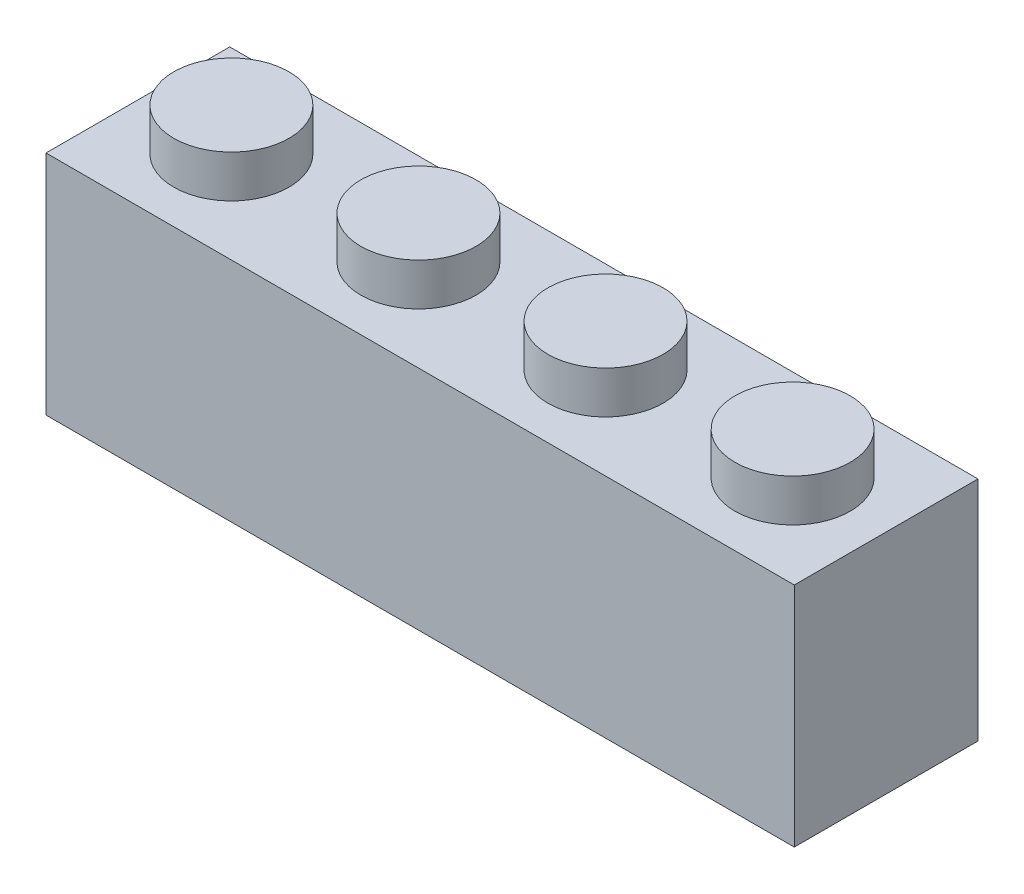
ISO-10303-21;
HEADER;
FILE_DESCRIPTION(('STEP AP214'),'2;1');
FILE_NAME('part.step','',(''),(''),'','','');
FILE_SCHEMA(('AUTOMOTIVE_DESIGN { 1 0 10303 214 1 1 1 1 }'));
ENDSEC;
DATA;
#1=APPLICATION_CONTEXT('core data for automotive mechanical design processes');
#2=APPLICATION_PROTOCOL_DEFINITION('international standard','automotive_design',2000,#1);
#3=PRODUCT_CONTEXT('',#1,'mechanical');
#4=PRODUCT('Part','Part','',(#3));
#5=PRODUCT_RELATED_PRODUCT_CATEGORY('part','',(#4));
#6=PRODUCT_DEFINITION_FORMATION('','',#4);
#7=PRODUCT_DEFINITION_CONTEXT('part definition',#1,'design');
#8=PRODUCT_DEFINITION('design','',#6,#7);
#9=PRODUCT_DEFINITION_SHAPE('','',#8);
#10=(LENGTH_UNIT() NAMED_UNIT(*) SI_UNIT(.MILLI.,.METRE.));
#11=(NAMED_UNIT(*) PLANE_ANGLE_UNIT() SI_UNIT($,.RADIAN.));
#12=(NAMED_UNIT(*) SI_UNIT($,.STERADIAN.) SOLID_ANGLE_UNIT());
#13=UNCERTAINTY_MEASURE_WITH_UNIT(LENGTH_MEASURE(1.E-05),#10,'distance_accuracy_value','');
#14=(GEOMETRIC_REPRESENTATION_CONTEXT(3) GLOBAL_UNCERTAINTY_ASSIGNED_CONTEXT((#13)) GLOBAL_UNIT_ASSIGNED_CONTEXT((#10,
#11,#12)) REPRESENTATION_CONTEXT('',''));
#15=CARTESIAN_POINT('',(0.,0.,0.));
#16=DIRECTION('',(0.,0.,1.));
#17=DIRECTION('',(1.,0.,0.));
#18=AXIS2_PLACEMENT_3D('',#15,#16,#17);
#19=CARTESIAN_POINT('',(15.905,-9.65,-3.905));
#20=DIRECTION('',(1.,0.,0.));
#21=DIRECTION('',(0.,0.,-1.));
#22=AXIS2_PLACEMENT_3D('',#19,#20,#21);
#23=PLANE('',#22);
#24=DIRECTION('',(0.,0.,-1.));
#25=VECTOR('',#24,1.);
#26=CARTESIAN_POINT('',(15.905,0.,-3.905));
#27=LINE('',#26,#25);
#28=CARTESIAN_POINT('',(15.905,0.,3.905));
#29=VERTEX_POINT('',#28);
#30=CARTESIAN_POINT('',(15.905,0.,-3.905));
#31=VERTEX_POINT('',#30);
#32=EDGE_CURVE('E195',#29,#31,#27,.T.);
#33=ORIENTED_EDGE('',*,*,#32,.F.);
#34=DIRECTION('',(0.,1.,0.));
#35=VECTOR('',#34,1.);
#36=CARTESIAN_POINT('',(15.905,-9.65,3.905));
#37=LINE('',#36,#35);
#38=CARTESIAN_POINT('',(15.905,-9.65,3.905));
#39=VERTEX_POINT('',#38);
#40=EDGE_CURVE('E58',#39,#29,#37,.T.);
#41=ORIENTED_EDGE('',*,*,#40,.F.);
#42=DIRECTION('',(0.,0.,-1.));
#43=VECTOR('',#42,1.);
#44=CARTESIAN_POINT('',(15.905,-9.65,-3.905));
#45=LINE('',#44,#43);
#46=CARTESIAN_POINT('',(15.905,-9.65,-3.905));
#47=VERTEX_POINT('',#46);
#48=EDGE_CURVE('E198',#39,#47,#45,.T.);
#49=ORIENTED_EDGE('',*,*,#48,.T.);
#50=DIRECTION('',(0.,1.,0.));
#51=VECTOR('',#50,1.);
#52=CARTESIAN_POINT('',(15.905,-9.65,-3.905));
#53=LINE('',#52,#51);
#54=EDGE_CURVE('E84',#47,#31,#53,.T.);
#55=ORIENTED_EDGE('',*,*,#54,.T.);
#56=EDGE_LOOP('',(#33,#41,#49,#55));
#57=FACE_BOUND('',#56,.T.);
#58=ADVANCED_FACE('F35',(#57),#23,.T.);
#59=CARTESIAN_POINT('',(-15.905,-9.65,3.905));
#60=DIRECTION('',(0.,0.,1.));
#61=DIRECTION('',(1.,0.,0.));
#62=AXIS2_PLACEMENT_3D('',#59,#60,#61);
#63=PLANE('',#62);
#64=DIRECTION('',(1.,0.,0.));
#65=VECTOR('',#64,1.);
#66=CARTESIAN_POINT('',(-15.905,0.,3.905));
#67=LINE('',#66,#65);
#68=CARTESIAN_POINT('',(-15.905,0.,3.905));
#69=VERTEX_POINT('',#68);
#70=EDGE_CURVE('E201',#69,#29,#67,.T.);
#71=ORIENTED_EDGE('',*,*,#70,.F.);
#72=DIRECTION('',(0.,1.,0.));
#73=VECTOR('',#72,1.);
#74=CARTESIAN_POINT('',(-15.905,-9.65,3.905));
#75=LINE('',#74,#73);
#76=CARTESIAN_POINT('',(-15.905,-9.65,3.905));
#77=VERTEX_POINT('',#76);
#78=EDGE_CURVE('E220',#77,#69,#75,.T.);
#79=ORIENTED_EDGE('',*,*,#78,.F.);
#80=DIRECTION('',(1.,0.,0.));
#81=VECTOR('',#80,1.);
#82=CARTESIAN_POINT('',(-15.905,-9.65,3.905));
#83=LINE('',#82,#81);
#84=EDGE_CURVE('E206',#77,#39,#83,.T.);
#85=ORIENTED_EDGE('',*,*,#84,.T.);
#86=ORIENTED_EDGE('',*,*,#40,.T.);
#87=EDGE_LOOP('',(#71,#79,#85,#86));
#88=FACE_BOUND('',#87,.T.);
#89=ADVANCED_FACE('F258',(#88),#63,.T.);
#90=CARTESIAN_POINT('',(-15.905,-9.65,-3.905));
#91=DIRECTION('',(-1.,0.,0.));
#92=DIRECTION('',(0.,0.,1.));
#93=AXIS2_PLACEMENT_3D('',#90,#91,#92);
#94=PLANE('',#93);
#95=DIRECTION('',(0.,0.,1.));
#96=VECTOR('',#95,1.);
#97=CARTESIAN_POINT('',(-15.905,0.,-3.905));
#98=LINE('',#97,#96);
#99=CARTESIAN_POINT('',(-15.905,0.,-3.905));
#100=VERTEX_POINT('',#99);
#101=EDGE_CURVE('E213',#100,#69,#98,.T.);
#102=ORIENTED_EDGE('',*,*,#101,.F.);
#103=DIRECTION('',(0.,1.,0.));
#104=VECTOR('',#103,1.);
#105=CARTESIAN_POINT('',(-15.905,-9.65,-3.905));
#106=LINE('',#105,#104);
#107=CARTESIAN_POINT('',(-15.905,-9.65,-3.905));
#108=VERTEX_POINT('',#107);
#109=EDGE_CURVE('E222',#108,#100,#106,.T.);
#110=ORIENTED_EDGE('',*,*,#109,.F.);
#111=DIRECTION('',(0.,0.,1.));
#112=VECTOR('',#111,1.);
#113=CARTESIAN_POINT('',(-15.905,-9.65,-3.905));
#114=LINE('',#113,#112);
#115=EDGE_CURVE('E203',#108,#77,#114,.T.);
#116=ORIENTED_EDGE('',*,*,#115,.T.);
#117=ORIENTED_EDGE('',*,*,#78,.T.);
#118=EDGE_LOOP('',(#102,#110,#116,#117));
#119=FACE_BOUND('',#118,.T.);
#120=ADVANCED_FACE('F262',(#119),#94,.T.);
#121=CARTESIAN_POINT('',(-15.905,-9.65,-3.905));
#122=DIRECTION('',(0.,0.,-1.));
#123=DIRECTION('',(-1.,0.,0.));
#124=AXIS2_PLACEMENT_3D('',#121,#122,#123);
#125=PLANE('',#124);
#126=DIRECTION('',(-1.,0.,0.));
#127=VECTOR('',#126,1.);
#128=CARTESIAN_POINT('',(-15.905,0.,-3.905));
#129=LINE('',#128,#127);
#130=EDGE_CURVE('E210',#31,#100,#129,.T.);
#131=ORIENTED_EDGE('',*,*,#130,.F.);
#132=ORIENTED_EDGE('',*,*,#54,.F.);
#133=DIRECTION('',(-1.,0.,0.));
#134=VECTOR('',#133,1.);
#135=CARTESIAN_POINT('',(-15.905,-9.65,-3.905));
#136=LINE('',#135,#134);
#137=EDGE_CURVE('E200',#47,#108,#136,.T.);
#138=ORIENTED_EDGE('',*,*,#137,.T.);
#139=ORIENTED_EDGE('',*,*,#109,.T.);
#140=EDGE_LOOP('',(#131,#132,#138,#139));
#141=FACE_BOUND('',#140,.T.);
#142=ADVANCED_FACE('F272',(#141),#125,.T.);
#143=CARTESIAN_POINT('',(0.,-9.65,0.));
#144=DIRECTION('',(0.,1.,0.));
#145=DIRECTION('',(0.,0.,1.));
#146=AXIS2_PLACEMENT_3D('',#143,#144,#145);
#147=PLANE('',#146);
#148=DIRECTION('',(1.,0.,0.));
#149=VECTOR('',#148,1.);
#150=CARTESIAN_POINT('',(0.,-9.65,2.405));
#151=LINE('',#150,#149);
#152=CARTESIAN_POINT('',(-14.405,-9.65,2.405));
#153=VERTEX_POINT('',#152);
#154=CARTESIAN_POINT('',(14.405,-9.65,2.405));
#155=VERTEX_POINT('',#154);
#156=EDGE_CURVE('E169',#153,#155,#151,.T.);
#157=ORIENTED_EDGE('',*,*,#156,.T.);
#158=DIRECTION('',(0.,0.,-1.));
#159=VECTOR('',#158,1.);
#160=CARTESIAN_POINT('',(14.405,-9.65,0.));
#161=LINE('',#160,#159);
#162=CARTESIAN_POINT('',(14.405,-9.65,-2.405));
#163=VERTEX_POINT('',#162);
#164=EDGE_CURVE('E113',#155,#163,#161,.T.);
#165=ORIENTED_EDGE('',*,*,#164,.T.);
#166=DIRECTION('',(-1.,0.,0.));
#167=VECTOR('',#166,1.);
#168=CARTESIAN_POINT('',(0.,-9.65,-2.405));
#169=LINE('',#168,#167);
#170=CARTESIAN_POINT('',(-14.405,-9.65,-2.405));
#171=VERTEX_POINT('',#170);
#172=EDGE_CURVE('E135',#163,#171,#169,.T.);
#173=ORIENTED_EDGE('',*,*,#172,.T.);
#174=DIRECTION('',(0.,0.,1.));
#175=VECTOR('',#174,1.);
#176=CARTESIAN_POINT('',(-14.405,-9.65,0.));
#177=LINE('',#176,#175);
#178=EDGE_CURVE('E49',#171,#153,#177,.T.);
#179=ORIENTED_EDGE('',*,*,#178,.T.);
#180=EDGE_LOOP('',(#157,#165,#173,#179));
#181=FACE_BOUND('',#180,.T.);
#182=ORIENTED_EDGE('',*,*,#48,.F.);
#183=ORIENTED_EDGE('',*,*,#84,.F.);
#184=ORIENTED_EDGE('',*,*,#115,.F.);
#185=ORIENTED_EDGE('',*,*,#137,.F.);
#186=EDGE_LOOP('',(#182,#183,#184,#185));
#187=FACE_BOUND('',#186,.T.);
#188=ADVANCED_FACE('F271',(#181,#187),#147,.F.);
#189=CARTESIAN_POINT('',(0.,0.,0.));
#190=DIRECTION('',(0.,1.,0.));
#191=DIRECTION('',(0.,0.,1.));
#192=AXIS2_PLACEMENT_3D('',#189,#190,#191);
#193=PLANE('',#192);
#194=CARTESIAN_POINT('',(11.92875,0.,0.));
#195=DIRECTION('',(0.,1.,0.));
#196=DIRECTION('',(0.,0.,1.));
#197=AXIS2_PLACEMENT_3D('',#194,#195,#196);
#198=CIRCLE('',#197,2.45);
#199=CARTESIAN_POINT('',(11.92875,0.,2.45));
#200=VERTEX_POINT('',#199);
#201=EDGE_CURVE('E118',#200,#200,#198,.T.);
#202=ORIENTED_EDGE('',*,*,#201,.F.);
#203=EDGE_LOOP('',(#202));
#204=FACE_BOUND('',#203,.T.);
#205=CARTESIAN_POINT('',(3.97625,0.,0.));
#206=DIRECTION('',(0.,1.,0.));
#207=DIRECTION('',(0.,0.,1.));
#208=AXIS2_PLACEMENT_3D('',#205,#206,#207);
#209=CIRCLE('',#208,2.45);
#210=CARTESIAN_POINT('',(3.97625,0.,2.45));
#211=VERTEX_POINT('',#210);
#212=EDGE_CURVE('E177',#211,#211,#209,.T.);
#213=ORIENTED_EDGE('',*,*,#212,.F.);
#214=EDGE_LOOP('',(#213));
#215=FACE_BOUND('',#214,.T.);
#216=CARTESIAN_POINT('',(-3.97625,0.,0.));
#217=DIRECTION('',(0.,1.,0.));
#218=DIRECTION('',(0.,0.,1.));
#219=AXIS2_PLACEMENT_3D('',#216,#217,#218);
#220=CIRCLE('',#219,2.45);
#221=CARTESIAN_POINT('',(-3.97625,0.,2.45));
#222=VERTEX_POINT('',#221);
#223=EDGE_CURVE('E183',#222,#222,#220,.T.);
#224=ORIENTED_EDGE('',*,*,#223,.F.);
#225=EDGE_LOOP('',(#224));
#226=FACE_BOUND('',#225,.T.);
#227=CARTESIAN_POINT('',(-11.92875,0.,0.));
#228=DIRECTION('',(0.,1.,0.));
#229=DIRECTION('',(0.,0.,1.));
#230=AXIS2_PLACEMENT_3D('',#227,#228,#229);
#231=CIRCLE('',#230,2.45);
#232=CARTESIAN_POINT('',(-11.92875,0.,2.45));
#233=VERTEX_POINT('',#232);
#234=EDGE_CURVE('E189',#233,#233,#231,.T.);
#235=ORIENTED_EDGE('',*,*,#234,.F.);
#236=EDGE_LOOP('',(#235));
#237=FACE_BOUND('',#236,.T.);
#238=ORIENTED_EDGE('',*,*,#32,.T.);
#239=ORIENTED_EDGE('',*,*,#130,.T.);
#240=ORIENTED_EDGE('',*,*,#101,.T.);
#241=ORIENTED_EDGE('',*,*,#70,.T.);
#242=EDGE_LOOP('',(#238,#239,#240,#241));
#243=FACE_BOUND('',#242,.T.);
#244=ADVANCED_FACE('F265',(#204,#215,#226,#237,#243),#193,.T.);
#245=CARTESIAN_POINT('',(-11.92875,1.8,0.));
#246=DIRECTION('',(0.,-1.,0.));
#247=DIRECTION('',(0.,0.,-1.));
#248=AXIS2_PLACEMENT_3D('',#245,#246,#247);
#249=CYLINDRICAL_SURFACE('',#248,2.45);
#250=CARTESIAN_POINT('',(-11.92875,1.8,0.));
#251=DIRECTION('',(0.,1.,0.));
#252=DIRECTION('',(0.,0.,1.));
#253=AXIS2_PLACEMENT_3D('',#250,#251,#252);
#254=CIRCLE('',#253,2.45);
#255=CARTESIAN_POINT('',(-11.92875,1.8,2.45));
#256=VERTEX_POINT('',#255);
#257=EDGE_CURVE('E192',#256,#256,#254,.T.);
#258=ORIENTED_EDGE('',*,*,#257,.F.);
#259=EDGE_LOOP('',(#258));
#260=FACE_BOUND('',#259,.T.);
#261=ORIENTED_EDGE('',*,*,#234,.T.);
#262=EDGE_LOOP('',(#261));
#263=FACE_BOUND('',#262,.T.);
#264=ADVANCED_FACE('F283',(#260,#263),#249,.T.);
#265=CARTESIAN_POINT('',(-11.92875,1.8,0.));
#266=DIRECTION('',(0.,1.,0.));
#267=DIRECTION('',(0.,0.,1.));
#268=AXIS2_PLACEMENT_3D('',#265,#266,#267);
#269=PLANE('',#268);
#270=ORIENTED_EDGE('',*,*,#257,.T.);
#271=EDGE_LOOP('',(#270));
#272=FACE_BOUND('',#271,.T.);
#273=ADVANCED_FACE('F288',(#272),#269,.T.);
#274=CARTESIAN_POINT('',(-3.97625,1.8,0.));
#275=DIRECTION('',(0.,-1.,0.));
#276=DIRECTION('',(0.,0.,-1.));
#277=AXIS2_PLACEMENT_3D('',#274,#275,#276);
#278=CYLINDRICAL_SURFACE('',#277,2.45);
#279=CARTESIAN_POINT('',(-3.97625,1.8,0.));
#280=DIRECTION('',(0.,1.,0.));
#281=DIRECTION('',(0.,0.,1.));
#282=AXIS2_PLACEMENT_3D('',#279,#280,#281);
#283=CIRCLE('',#282,2.45);
#284=CARTESIAN_POINT('',(-3.97625,1.8,2.45));
#285=VERTEX_POINT('',#284);
#286=EDGE_CURVE('E186',#285,#285,#283,.T.);
#287=ORIENTED_EDGE('',*,*,#286,.F.);
#288=EDGE_LOOP('',(#287));
#289=FACE_BOUND('',#288,.T.);
#290=ORIENTED_EDGE('',*,*,#223,.T.);
#291=EDGE_LOOP('',(#290));
#292=FACE_BOUND('',#291,.T.);
#293=ADVANCED_FACE('F292',(#289,#292),#278,.T.);
#294=CARTESIAN_POINT('',(-3.97625,1.8,0.));
#295=DIRECTION('',(0.,1.,0.));
#296=DIRECTION('',(0.,0.,1.));
#297=AXIS2_PLACEMENT_3D('',#294,#295,#296);
#298=PLANE('',#297);
#299=ORIENTED_EDGE('',*,*,#286,.T.);
#300=EDGE_LOOP('',(#299));
#301=FACE_BOUND('',#300,.T.);
#302=ADVANCED_FACE('F296',(#301),#298,.T.);
#303=CARTESIAN_POINT('',(3.97625,1.8,0.));
#304=DIRECTION('',(0.,-1.,0.));
#305=DIRECTION('',(0.,0.,-1.));
#306=AXIS2_PLACEMENT_3D('',#303,#304,#305);
#307=CYLINDRICAL_SURFACE('',#306,2.45);
#308=CARTESIAN_POINT('',(3.97625,1.8,0.));
#309=DIRECTION('',(0.,1.,0.));
#310=DIRECTION('',(0.,0.,1.));
#311=AXIS2_PLACEMENT_3D('',#308,#309,#310);
#312=CIRCLE('',#311,2.45);
#313=CARTESIAN_POINT('',(3.97625,1.8,2.45));
#314=VERTEX_POINT('',#313);
#315=EDGE_CURVE('E180',#314,#314,#312,.T.);
#316=ORIENTED_EDGE('',*,*,#315,.F.);
#317=EDGE_LOOP('',(#316));
#318=FACE_BOUND('',#317,.T.);
#319=ORIENTED_EDGE('',*,*,#212,.T.);
#320=EDGE_LOOP('',(#319));
#321=FACE_BOUND('',#320,.T.);
#322=ADVANCED_FACE('F300',(#318,#321),#307,.T.);
#323=CARTESIAN_POINT('',(3.97625,1.8,0.));
#324=DIRECTION('',(0.,1.,0.));
#325=DIRECTION('',(0.,0.,1.));
#326=AXIS2_PLACEMENT_3D('',#323,#324,#325);
#327=PLANE('',#326);
#328=ORIENTED_EDGE('',*,*,#315,.T.);
#329=EDGE_LOOP('',(#328));
#330=FACE_BOUND('',#329,.T.);
#331=ADVANCED_FACE('F304',(#330),#327,.T.);
#332=CARTESIAN_POINT('',(11.92875,1.8,0.));
#333=DIRECTION('',(0.,-1.,0.));
#334=DIRECTION('',(0.,0.,-1.));
#335=AXIS2_PLACEMENT_3D('',#332,#333,#334);
#336=CYLINDRICAL_SURFACE('',#335,2.45);
#337=CARTESIAN_POINT('',(11.92875,1.8,0.));
#338=DIRECTION('',(0.,1.,0.));
#339=DIRECTION('',(0.,0.,1.));
#340=AXIS2_PLACEMENT_3D('',#337,#338,#339);
#341=CIRCLE('',#340,2.45);
#342=CARTESIAN_POINT('',(11.92875,1.8,2.45));
#343=VERTEX_POINT('',#342);
#344=EDGE_CURVE('E174',#343,#343,#341,.T.);
#345=ORIENTED_EDGE('',*,*,#344,.F.);
#346=EDGE_LOOP('',(#345));
#347=FACE_BOUND('',#346,.T.);
#348=ORIENTED_EDGE('',*,*,#201,.T.);
#349=EDGE_LOOP('',(#348));
#350=FACE_BOUND('',#349,.T.);
#351=ADVANCED_FACE('F308',(#347,#350),#336,.T.);
#352=CARTESIAN_POINT('',(11.92875,1.8,0.));
#353=DIRECTION('',(0.,1.,0.));
#354=DIRECTION('',(0.,0.,1.));
#355=AXIS2_PLACEMENT_3D('',#352,#353,#354);
#356=PLANE('',#355);
#357=ORIENTED_EDGE('',*,*,#344,.T.);
#358=EDGE_LOOP('',(#357));
#359=FACE_BOUND('',#358,.T.);
#360=ADVANCED_FACE('F312',(#359),#356,.T.);
#361=CARTESIAN_POINT('',(14.405,-9.65,-3.905));
#362=DIRECTION('',(1.,0.,0.));
#363=DIRECTION('',(0.,0.,-1.));
#364=AXIS2_PLACEMENT_3D('',#361,#362,#363);
#365=PLANE('',#364);
#366=DIRECTION('',(0.,0.,-1.));
#367=VECTOR('',#366,1.);
#368=CARTESIAN_POINT('',(14.405,-1.5,0.));
#369=LINE('',#368,#367);
#370=CARTESIAN_POINT('',(14.405,-1.5,2.405));
#371=VERTEX_POINT('',#370);
#372=CARTESIAN_POINT('',(14.405,-1.5,-2.405));
#373=VERTEX_POINT('',#372);
#374=EDGE_CURVE('E111',#371,#373,#369,.T.);
#375=ORIENTED_EDGE('',*,*,#374,.T.);
#376=DIRECTION('',(0.,1.,0.));
#377=VECTOR('',#376,1.);
#378=CARTESIAN_POINT('',(14.405,-9.65,-2.405));
#379=LINE('',#378,#377);
#380=EDGE_CURVE('E140',#163,#373,#379,.T.);
#381=ORIENTED_EDGE('',*,*,#380,.F.);
#382=ORIENTED_EDGE('',*,*,#164,.F.);
#383=DIRECTION('',(0.,1.,0.));
#384=VECTOR('',#383,1.);
#385=CARTESIAN_POINT('',(14.405,-9.65,2.405));
#386=LINE('',#385,#384);
#387=EDGE_CURVE('E108',#155,#371,#386,.T.);
#388=ORIENTED_EDGE('',*,*,#387,.T.);
#389=EDGE_LOOP('',(#375,#381,#382,#388));
#390=FACE_BOUND('',#389,.T.);
#391=ADVANCED_FACE('F110',(#390),#365,.F.);
#392=CARTESIAN_POINT('',(-15.905,-9.65,2.405));
#393=DIRECTION('',(0.,0.,1.));
#394=DIRECTION('',(1.,0.,0.));
#395=AXIS2_PLACEMENT_3D('',#392,#393,#394);
#396=PLANE('',#395);
#397=DIRECTION('',(1.,0.,0.));
#398=VECTOR('',#397,1.);
#399=CARTESIAN_POINT('',(0.,-1.5,2.405));
#400=LINE('',#399,#398);
#401=CARTESIAN_POINT('',(-14.405,-1.5,2.405));
#402=VERTEX_POINT('',#401);
#403=EDGE_CURVE('E126',#402,#371,#400,.T.);
#404=ORIENTED_EDGE('',*,*,#403,.T.);
#405=ORIENTED_EDGE('',*,*,#387,.F.);
#406=ORIENTED_EDGE('',*,*,#156,.F.);
#407=DIRECTION('',(0.,1.,0.));
#408=VECTOR('',#407,1.);
#409=CARTESIAN_POINT('',(-14.405,-9.65,2.405));
#410=LINE('',#409,#408);
#411=EDGE_CURVE('E119',#153,#402,#410,.T.);
#412=ORIENTED_EDGE('',*,*,#411,.T.);
#413=EDGE_LOOP('',(#404,#405,#406,#412));
#414=FACE_BOUND('',#413,.T.);
#415=ADVANCED_FACE('F131',(#414),#396,.F.);
#416=CARTESIAN_POINT('',(-14.405,-9.65,-3.905));
#417=DIRECTION('',(-1.,0.,0.));
#418=DIRECTION('',(0.,0.,1.));
#419=AXIS2_PLACEMENT_3D('',#416,#417,#418);
#420=PLANE('',#419);
#421=DIRECTION('',(0.,0.,1.));
#422=VECTOR('',#421,1.);
#423=CARTESIAN_POINT('',(-14.405,-1.5,0.));
#424=LINE('',#423,#422);
#425=CARTESIAN_POINT('',(-14.405,-1.5,-2.405));
#426=VERTEX_POINT('',#425);
#427=EDGE_CURVE('E133',#426,#402,#424,.T.);
#428=ORIENTED_EDGE('',*,*,#427,.T.);
#429=ORIENTED_EDGE('',*,*,#411,.F.);
#430=ORIENTED_EDGE('',*,*,#178,.F.);
#431=DIRECTION('',(0.,1.,0.));
#432=VECTOR('',#431,1.);
#433=CARTESIAN_POINT('',(-14.405,-9.65,-2.405));
#434=LINE('',#433,#432);
#435=EDGE_CURVE('E141',#171,#426,#434,.T.);
#436=ORIENTED_EDGE('',*,*,#435,.T.);
#437=EDGE_LOOP('',(#428,#429,#430,#436));
#438=FACE_BOUND('',#437,.T.);
#439=ADVANCED_FACE('F457',(#438),#420,.F.);
#440=CARTESIAN_POINT('',(-15.905,-9.65,-2.405));
#441=DIRECTION('',(0.,0.,-1.));
#442=DIRECTION('',(-1.,0.,0.));
#443=AXIS2_PLACEMENT_3D('',#440,#441,#442);
#444=PLANE('',#443);
#445=DIRECTION('',(-1.,0.,0.));
#446=VECTOR('',#445,1.);
#447=CARTESIAN_POINT('',(0.,-1.5,-2.405));
#448=LINE('',#447,#446);
#449=EDGE_CURVE('E128',#373,#426,#448,.T.);
#450=ORIENTED_EDGE('',*,*,#449,.T.);
#451=ORIENTED_EDGE('',*,*,#435,.F.);
#452=ORIENTED_EDGE('',*,*,#172,.F.);
#453=ORIENTED_EDGE('',*,*,#380,.T.);
#454=EDGE_LOOP('',(#450,#451,#452,#453));
#455=FACE_BOUND('',#454,.T.);
#456=ADVANCED_FACE('F234',(#455),#444,.F.);
#457=CARTESIAN_POINT('',(0.,-1.5,0.));
#458=DIRECTION('',(0.,1.,0.));
#459=DIRECTION('',(0.,0.,1.));
#460=AXIS2_PLACEMENT_3D('',#457,#458,#459);
#461=PLANE('',#460);
#462=CARTESIAN_POINT('',(7.9525,-1.5,0.));
#463=DIRECTION('',(0.,1.,0.));
#464=DIRECTION('',(0.,0.,1.));
#465=AXIS2_PLACEMENT_3D('',#462,#463,#464);
#466=CIRCLE('',#465,1.5);
#467=CARTESIAN_POINT('',(7.9525,-1.5,1.5));
#468=VERTEX_POINT('',#467);
#469=EDGE_CURVE('E12',#468,#468,#466,.F.);
#470=ORIENTED_EDGE('',*,*,#469,.F.);
#471=EDGE_LOOP('',(#470));
#472=FACE_BOUND('',#471,.T.);
#473=CARTESIAN_POINT('',(0.,-1.5,0.));
#474=DIRECTION('',(0.,1.,0.));
#475=DIRECTION('',(0.,0.,1.));
#476=AXIS2_PLACEMENT_3D('',#473,#474,#475);
#477=CIRCLE('',#476,1.5);
#478=CARTESIAN_POINT('',(0.,-1.5,1.5));
#479=VERTEX_POINT('',#478);
#480=EDGE_CURVE('E42',#479,#479,#477,.F.);
#481=ORIENTED_EDGE('',*,*,#480,.F.);
#482=EDGE_LOOP('',(#481));
#483=FACE_BOUND('',#482,.T.);
#484=CARTESIAN_POINT('',(-7.9525,-1.5,0.));
#485=DIRECTION('',(0.,1.,0.));
#486=DIRECTION('',(0.,0.,1.));
#487=AXIS2_PLACEMENT_3D('',#484,#485,#486);
#488=CIRCLE('',#487,1.5);
#489=CARTESIAN_POINT('',(-7.9525,-1.5,1.5));
#490=VERTEX_POINT('',#489);
#491=EDGE_CURVE('E219',#490,#490,#488,.F.);
#492=ORIENTED_EDGE('',*,*,#491,.F.);
#493=EDGE_LOOP('',(#492));
#494=FACE_BOUND('',#493,.T.);
#495=CARTESIAN_POINT('',(11.92875,-1.5,0.));
#496=DIRECTION('',(0.,1.,0.));
#497=DIRECTION('',(0.,0.,1.));
#498=AXIS2_PLACEMENT_3D('',#495,#496,#497);
#499=CIRCLE('',#498,0.950000000000001);
#500=CARTESIAN_POINT('',(11.92875,-1.5,0.950000000000001));
#501=VERTEX_POINT('',#500);
#502=EDGE_CURVE('E145',#501,#501,#499,.T.);
#503=ORIENTED_EDGE('',*,*,#502,.T.);
#504=EDGE_LOOP('',(#503));
#505=FACE_BOUND('',#504,.T.);
#506=CARTESIAN_POINT('',(3.97625,-1.5,0.));
#507=DIRECTION('',(0.,1.,0.));
#508=DIRECTION('',(0.,0.,1.));
#509=AXIS2_PLACEMENT_3D('',#506,#507,#508);
#510=CIRCLE('',#509,0.950000000000001);
#511=CARTESIAN_POINT('',(3.97625,-1.5,0.950000000000001));
#512=VERTEX_POINT('',#511);
#513=EDGE_CURVE('E150',#512,#512,#510,.T.);
#514=ORIENTED_EDGE('',*,*,#513,.T.);
#515=EDGE_LOOP('',(#514));
#516=FACE_BOUND('',#515,.T.);
#517=CARTESIAN_POINT('',(-3.97625,-1.5,0.));
#518=DIRECTION('',(0.,1.,0.));
#519=DIRECTION('',(0.,0.,1.));
#520=AXIS2_PLACEMENT_3D('',#517,#518,#519);
#521=CIRCLE('',#520,0.950000000000001);
#522=CARTESIAN_POINT('',(-3.97625,-1.5,0.950000000000001));
#523=VERTEX_POINT('',#522);
#524=EDGE_CURVE('E154',#523,#523,#521,.T.);
#525=ORIENTED_EDGE('',*,*,#524,.T.);
#526=EDGE_LOOP('',(#525));
#527=FACE_BOUND('',#526,.T.);
#528=CARTESIAN_POINT('',(-11.92875,-1.5,0.));
#529=DIRECTION('',(0.,1.,0.));
#530=DIRECTION('',(0.,0.,1.));
#531=AXIS2_PLACEMENT_3D('',#528,#529,#530);
#532=CIRCLE('',#531,0.950000000000001);
#533=CARTESIAN_POINT('',(-11.92875,-1.5,0.950000000000001));
#534=VERTEX_POINT('',#533);
#535=EDGE_CURVE('E158',#534,#534,#532,.T.);
#536=ORIENTED_EDGE('',*,*,#535,.T.);
#537=EDGE_LOOP('',(#536));
#538=FACE_BOUND('',#537,.T.);
#539=ORIENTED_EDGE('',*,*,#374,.F.);
#540=ORIENTED_EDGE('',*,*,#403,.F.);
#541=ORIENTED_EDGE('',*,*,#427,.F.);
#542=ORIENTED_EDGE('',*,*,#449,.F.);
#543=EDGE_LOOP('',(#539,#540,#541,#542));
#544=FACE_BOUND('',#543,.T.);
#545=ADVANCED_FACE('F124',(#472,#483,#494,#505,#516,#527,#538,#544),#461,.F.);
#546=CARTESIAN_POINT('',(-11.92875,1.8,0.));
#547=DIRECTION('',(0.,-1.,0.));
#548=DIRECTION('',(0.,0.,-1.));
#549=AXIS2_PLACEMENT_3D('',#546,#547,#548);
#550=CYLINDRICAL_SURFACE('',#549,0.950000000000001);
#551=CARTESIAN_POINT('',(-11.92875,0.3,0.));
#552=DIRECTION('',(0.,1.,0.));
#553=DIRECTION('',(0.,0.,1.));
#554=AXIS2_PLACEMENT_3D('',#551,#552,#553);
#555=CIRCLE('',#554,0.950000000000001);
#556=CARTESIAN_POINT('',(-11.92875,0.3,0.950000000000001));
#557=VERTEX_POINT('',#556);
#558=EDGE_CURVE('E129',#557,#557,#555,.T.);
#559=ORIENTED_EDGE('',*,*,#558,.T.);
#560=EDGE_LOOP('',(#559));
#561=FACE_BOUND('',#560,.T.);
#562=ORIENTED_EDGE('',*,*,#535,.F.);
#563=EDGE_LOOP('',(#562));
#564=FACE_BOUND('',#563,.T.);
#565=ADVANCED_FACE('F233',(#561,#564),#550,.F.);
#566=CARTESIAN_POINT('',(-11.92875,0.3,0.));
#567=DIRECTION('',(0.,1.,0.));
#568=DIRECTION('',(0.,0.,1.));
#569=AXIS2_PLACEMENT_3D('',#566,#567,#568);
#570=PLANE('',#569);
#571=ORIENTED_EDGE('',*,*,#558,.F.);
#572=EDGE_LOOP('',(#571));
#573=FACE_BOUND('',#572,.T.);
#574=ADVANCED_FACE('F248',(#573),#570,.F.);
#575=CARTESIAN_POINT('',(-3.97625,1.8,0.));
#576=DIRECTION('',(0.,-1.,0.));
#577=DIRECTION('',(0.,0.,-1.));
#578=AXIS2_PLACEMENT_3D('',#575,#576,#577);
#579=CYLINDRICAL_SURFACE('',#578,0.950000000000001);
#580=CARTESIAN_POINT('',(-3.97625,0.3,0.));
#581=DIRECTION('',(0.,1.,0.));
#582=DIRECTION('',(0.,0.,1.));
#583=AXIS2_PLACEMENT_3D('',#580,#581,#582);
#584=CIRCLE('',#583,0.950000000000001);
#585=CARTESIAN_POINT('',(-3.97625,0.3,0.950000000000001));
#586=VERTEX_POINT('',#585);
#587=EDGE_CURVE('E157',#586,#586,#584,.T.);
#588=ORIENTED_EDGE('',*,*,#587,.T.);
#589=EDGE_LOOP('',(#588));
#590=FACE_BOUND('',#589,.T.);
#591=ORIENTED_EDGE('',*,*,#524,.F.);
#592=EDGE_LOOP('',(#591));
#593=FACE_BOUND('',#592,.T.);
#594=ADVANCED_FACE('F254',(#590,#593),#579,.F.);
#595=CARTESIAN_POINT('',(-3.97625,0.3,0.));
#596=DIRECTION('',(0.,1.,0.));
#597=DIRECTION('',(0.,0.,1.));
#598=AXIS2_PLACEMENT_3D('',#595,#596,#597);
#599=PLANE('',#598);
#600=ORIENTED_EDGE('',*,*,#587,.F.);
#601=EDGE_LOOP('',(#600));
#602=FACE_BOUND('',#601,.T.);
#603=ADVANCED_FACE('F333',(#602),#599,.F.);
#604=CARTESIAN_POINT('',(3.97625,1.8,0.));
#605=DIRECTION('',(0.,-1.,0.));
#606=DIRECTION('',(0.,0.,-1.));
#607=AXIS2_PLACEMENT_3D('',#604,#605,#606);
#608=CYLINDRICAL_SURFACE('',#607,0.950000000000001);
#609=CARTESIAN_POINT('',(3.97625,0.3,0.));
#610=DIRECTION('',(0.,1.,0.));
#611=DIRECTION('',(0.,0.,1.));
#612=AXIS2_PLACEMENT_3D('',#609,#610,#611);
#613=CIRCLE('',#612,0.950000000000001);
#614=CARTESIAN_POINT('',(3.97625,0.3,0.950000000000001));
#615=VERTEX_POINT('',#614);
#616=EDGE_CURVE('E153',#615,#615,#613,.T.);
#617=ORIENTED_EDGE('',*,*,#616,.T.);
#618=EDGE_LOOP('',(#617));
#619=FACE_BOUND('',#618,.T.);
#620=ORIENTED_EDGE('',*,*,#513,.F.);
#621=EDGE_LOOP('',(#620));
#622=FACE_BOUND('',#621,.T.);
#623=ADVANCED_FACE('F329',(#619,#622),#608,.F.);
#624=CARTESIAN_POINT('',(3.97625,0.3,0.));
#625=DIRECTION('',(0.,1.,0.));
#626=DIRECTION('',(0.,0.,1.));
#627=AXIS2_PLACEMENT_3D('',#624,#625,#626);
#628=PLANE('',#627);
#629=ORIENTED_EDGE('',*,*,#616,.F.);
#630=EDGE_LOOP('',(#629));
#631=FACE_BOUND('',#630,.T.);
#632=ADVANCED_FACE('F325',(#631),#628,.F.);
#633=CARTESIAN_POINT('',(11.92875,1.8,0.));
#634=DIRECTION('',(0.,-1.,0.));
#635=DIRECTION('',(0.,0.,-1.));
#636=AXIS2_PLACEMENT_3D('',#633,#634,#635);
#637=CYLINDRICAL_SURFACE('',#636,0.950000000000001);
#638=CARTESIAN_POINT('',(11.92875,0.3,0.));
#639=DIRECTION('',(0.,1.,0.));
#640=DIRECTION('',(0.,0.,1.));
#641=AXIS2_PLACEMENT_3D('',#638,#639,#640);
#642=CIRCLE('',#641,0.950000000000001);
#643=CARTESIAN_POINT('',(11.92875,0.3,0.950000000000001));
#644=VERTEX_POINT('',#643);
#645=EDGE_CURVE('E148',#644,#644,#642,.T.);
#646=ORIENTED_EDGE('',*,*,#645,.T.);
#647=EDGE_LOOP('',(#646));
#648=FACE_BOUND('',#647,.T.);
#649=ORIENTED_EDGE('',*,*,#502,.F.);
#650=EDGE_LOOP('',(#649));
#651=FACE_BOUND('',#650,.T.);
#652=ADVANCED_FACE('F321',(#648,#651),#637,.F.);
#653=CARTESIAN_POINT('',(11.92875,0.3,0.));
#654=DIRECTION('',(0.,1.,0.));
#655=DIRECTION('',(0.,0.,1.));
#656=AXIS2_PLACEMENT_3D('',#653,#654,#655);
#657=PLANE('',#656);
#658=ORIENTED_EDGE('',*,*,#645,.F.);
#659=EDGE_LOOP('',(#658));
#660=FACE_BOUND('',#659,.T.);
#661=ADVANCED_FACE('F317',(#660),#657,.F.);
#662=CARTESIAN_POINT('',(-7.9525,-13.8926406871193,0.));
#663=DIRECTION('',(0.,1.,0.));
#664=DIRECTION('',(0.,0.,1.));
#665=AXIS2_PLACEMENT_3D('',#662,#663,#664);
#666=CYLINDRICAL_SURFACE('',#665,1.5);
#667=CARTESIAN_POINT('',(-7.9525,-9.45,0.));
#668=DIRECTION('',(0.,1.,0.));
#669=DIRECTION('',(0.,0.,1.));
#670=AXIS2_PLACEMENT_3D('',#667,#668,#669);
#671=CIRCLE('',#670,1.5);
#672=CARTESIAN_POINT('',(-7.9525,-9.45,1.5));
#673=VERTEX_POINT('',#672);
#674=EDGE_CURVE('E149',#673,#673,#671,.T.);
#675=CARTESIAN_POINT('',(-7.9525,-9.45,1.5));
#676=CARTESIAN_POINT('',(-7.9525,-9.3671875,1.5));
#677=CARTESIAN_POINT('',(-7.9525,-9.284375,1.5));
#678=CARTESIAN_POINT('',(-7.9525,-9.11875,1.5));
#679=CARTESIAN_POINT('',(-7.9525,-9.0359375,1.5));
#680=CARTESIAN_POINT('',(-7.9525,-8.8703125,1.5));
#681=CARTESIAN_POINT('',(-7.9525,-8.7875,1.5));
#682=CARTESIAN_POINT('',(-7.9525,-8.621875,1.5));
#683=CARTESIAN_POINT('',(-7.9525,-8.5390625,1.5));
#684=CARTESIAN_POINT('',(-7.9525,-8.3734375,1.5));
#685=CARTESIAN_POINT('',(-7.9525,-8.290625,1.5));
#686=CARTESIAN_POINT('',(-7.9525,-8.125,1.5));
#687=CARTESIAN_POINT('',(-7.9525,-8.0421875,1.5));
#688=CARTESIAN_POINT('',(-7.9525,-7.8765625,1.5));
#689=CARTESIAN_POINT('',(-7.9525,-7.79375,1.5));
#690=CARTESIAN_POINT('',(-7.9525,-7.628125,1.5));
#691=CARTESIAN_POINT('',(-7.9525,-7.5453125,1.5));
#692=CARTESIAN_POINT('',(-7.9525,-7.3796875,1.5));
#693=CARTESIAN_POINT('',(-7.9525,-7.296875,1.5));
#694=CARTESIAN_POINT('',(-7.9525,-7.13125,1.5));
#695=CARTESIAN_POINT('',(-7.9525,-7.0484375,1.5));
#696=CARTESIAN_POINT('',(-7.9525,-6.8828125,1.5));
#697=CARTESIAN_POINT('',(-7.9525,-6.8,1.5));
#698=CARTESIAN_POINT('',(-7.9525,-6.634375,1.5));
#699=CARTESIAN_POINT('',(-7.9525,-6.5515625,1.5));
#700=CARTESIAN_POINT('',(-7.9525,-6.3859375,1.5));
#701=CARTESIAN_POINT('',(-7.9525,-6.303125,1.5));
#702=CARTESIAN_POINT('',(-7.9525,-6.1375,1.5));
#703=CARTESIAN_POINT('',(-7.9525,-6.0546875,1.5));
#704=CARTESIAN_POINT('',(-7.9525,-5.8890625,1.5));
#705=CARTESIAN_POINT('',(-7.9525,-5.80625,1.5));
#706=CARTESIAN_POINT('',(-7.9525,-5.640625,1.5));
#707=CARTESIAN_POINT('',(-7.9525,-5.5578125,1.5));
#708=CARTESIAN_POINT('',(-7.9525,-5.3921875,1.5));
#709=CARTESIAN_POINT('',(-7.9525,-5.309375,1.5));
#710=CARTESIAN_POINT('',(-7.9525,-5.14375,1.5));
#711=CARTESIAN_POINT('',(-7.9525,-5.0609375,1.5));
#712=CARTESIAN_POINT('',(-7.9525,-4.8953125,1.5));
#713=CARTESIAN_POINT('',(-7.9525,-4.8125,1.5));
#714=CARTESIAN_POINT('',(-7.9525,-4.646875,1.5));
#715=CARTESIAN_POINT('',(-7.9525,-4.5640625,1.5));
#716=CARTESIAN_POINT('',(-7.9525,-4.3984375,1.5));
#717=CARTESIAN_POINT('',(-7.9525,-4.315625,1.5));
#718=CARTESIAN_POINT('',(-7.9525,-4.15,1.5));
#719=CARTESIAN_POINT('',(-7.9525,-4.0671875,1.5));
#720=CARTESIAN_POINT('',(-7.9525,-3.9015625,1.5));
#721=CARTESIAN_POINT('',(-7.9525,-3.81875,1.5));
#722=CARTESIAN_POINT('',(-7.9525,-3.653125,1.5));
#723=CARTESIAN_POINT('',(-7.9525,-3.5703125,1.5));
#724=CARTESIAN_POINT('',(-7.9525,-3.4046875,1.5));
#725=CARTESIAN_POINT('',(-7.9525,-3.321875,1.5));
#726=CARTESIAN_POINT('',(-7.9525,-3.15625,1.5));
#727=CARTESIAN_POINT('',(-7.9525,-3.0734375,1.5));
#728=CARTESIAN_POINT('',(-7.9525,-2.9078125,1.5));
#729=CARTESIAN_POINT('',(-7.9525,-2.825,1.5));
#730=CARTESIAN_POINT('',(-7.9525,-2.659375,1.5));
#731=CARTESIAN_POINT('',(-7.9525,-2.5765625,1.5));
#732=CARTESIAN_POINT('',(-7.9525,-2.4109375,1.5));
#733=CARTESIAN_POINT('',(-7.9525,-2.328125,1.5));
#734=CARTESIAN_POINT('',(-7.9525,-2.1625,1.5));
#735=CARTESIAN_POINT('',(-7.9525,-2.0796875,1.5));
#736=CARTESIAN_POINT('',(-7.9525,-1.9140625,1.5));
#737=CARTESIAN_POINT('',(-7.9525,-1.83125,1.5));
#738=CARTESIAN_POINT('',(-7.9525,-1.665625,1.5));
#739=CARTESIAN_POINT('',(-7.9525,-1.5828125,1.5));
#740=CARTESIAN_POINT('',(-7.9525,-1.5,1.5));
#741=B_SPLINE_CURVE_WITH_KNOTS('',3,(#675,#676,#677,#678,#679,#680,#681,#682,#683,#684,#685,
#686,#687,#688,#689,#690,#691,#692,#693,#694,#695,#696,#697,#698,#699,#700,#701,#702,#703,#704,
#705,#706,#707,#708,#709,#710,#711,#712,#713,#714,#715,#716,#717,#718,#719,#720,#721,#722,#723,
#724,#725,#726,#727,#728,#729,#730,#731,#732,#733,#734,#735,#736,#737,#738,#739,#740),
.UNSPECIFIED.,.F.,.F.,(4,2,2,2,2,2,2,2,2,2,2,2,2,2,2,2,2,2,2,2,2,2,2,2,2,2,2,2,2,2,2,2,4),(0.,
0.2484375,0.496874999999999,0.745312499999999,0.993749999999998,1.2421875,1.490625,1.7390625,
1.9875,2.2359375,2.484375,2.7328125,2.98125,3.2296875,3.478125,3.7265625,3.975,4.2234375,
4.471875,4.7203125,4.96875,5.2171875,5.465625,5.7140625,5.9625,6.2109375,6.459375,6.7078125,
6.95625,7.2046875,7.453125,7.7015625,7.95),.UNSPECIFIED.);
#742=EDGE_CURVE('BSEAM320',#673,#490,#741,.T.);
#743=ORIENTED_EDGE('',*,*,#674,.T.);
#744=ORIENTED_EDGE('',*,*,#491,.T.);
#745=ORIENTED_EDGE('',*,*,#742,.T.);
#746=ORIENTED_EDGE('',*,*,#742,.F.);
#747=EDGE_LOOP('',(#743,#745,#744,#746));
#748=FACE_BOUND('',#747,.T.);
#749=ADVANCED_FACE('F320',(#748),#666,.T.);
#750=CARTESIAN_POINT('',(0.,-9.45,0.));
#751=DIRECTION('',(0.,1.,0.));
#752=DIRECTION('',(0.,0.,1.));
#753=AXIS2_PLACEMENT_3D('',#750,#751,#752);
#754=PLANE('',#753);
#755=ORIENTED_EDGE('',*,*,#674,.F.);
#756=EDGE_LOOP('',(#755));
#757=FACE_BOUND('',#756,.T.);
#758=ADVANCED_FACE('F373',(#757),#754,.F.);
#759=CARTESIAN_POINT('',(0.,-13.8926406871193,0.));
#760=DIRECTION('',(0.,1.,0.));
#761=DIRECTION('',(0.,0.,1.));
#762=AXIS2_PLACEMENT_3D('',#759,#760,#761);
#763=CYLINDRICAL_SURFACE('',#762,1.5);
#764=CARTESIAN_POINT('',(0.,-9.45,0.));
#765=DIRECTION('',(0.,1.,0.));
#766=DIRECTION('',(0.,0.,1.));
#767=AXIS2_PLACEMENT_3D('',#764,#765,#766);
#768=CIRCLE('',#767,1.5);
#769=CARTESIAN_POINT('',(0.,-9.45,1.5));
#770=VERTEX_POINT('',#769);
#771=EDGE_CURVE('E570',#770,#770,#768,.T.);
#772=CARTESIAN_POINT('',(0.,-9.45,1.5));
#773=CARTESIAN_POINT('',(0.,-9.3671875,1.5));
#774=CARTESIAN_POINT('',(0.,-9.284375,1.5));
#775=CARTESIAN_POINT('',(0.,-9.11875,1.5));
#776=CARTESIAN_POINT('',(0.,-9.0359375,1.5));
#777=CARTESIAN_POINT('',(0.,-8.8703125,1.5));
#778=CARTESIAN_POINT('',(0.,-8.7875,1.5));
#779=CARTESIAN_POINT('',(0.,-8.621875,1.5));
#780=CARTESIAN_POINT('',(0.,-8.5390625,1.5));
#781=CARTESIAN_POINT('',(0.,-8.3734375,1.5));
#782=CARTESIAN_POINT('',(0.,-8.290625,1.5));
#783=CARTESIAN_POINT('',(0.,-8.125,1.5));
#784=CARTESIAN_POINT('',(0.,-8.0421875,1.5));
#785=CARTESIAN_POINT('',(0.,-7.8765625,1.5));
#786=CARTESIAN_POINT('',(0.,-7.79375,1.5));
#787=CARTESIAN_POINT('',(0.,-7.628125,1.5));
#788=CARTESIAN_POINT('',(0.,-7.5453125,1.5));
#789=CARTESIAN_POINT('',(0.,-7.3796875,1.5));
#790=CARTESIAN_POINT('',(0.,-7.296875,1.5));
#791=CARTESIAN_POINT('',(0.,-7.13125,1.5));
#792=CARTESIAN_POINT('',(0.,-7.0484375,1.5));
#793=CARTESIAN_POINT('',(0.,-6.8828125,1.5));
#794=CARTESIAN_POINT('',(0.,-6.8,1.5));
#795=CARTESIAN_POINT('',(0.,-6.634375,1.5));
#796=CARTESIAN_POINT('',(0.,-6.5515625,1.5));
#797=CARTESIAN_POINT('',(0.,-6.3859375,1.5));
#798=CARTESIAN_POINT('',(0.,-6.303125,1.5));
#799=CARTESIAN_POINT('',(0.,-6.1375,1.5));
#800=CARTESIAN_POINT('',(0.,-6.0546875,1.5));
#801=CARTESIAN_POINT('',(0.,-5.8890625,1.5));
#802=CARTESIAN_POINT('',(0.,-5.80625,1.5));
#803=CARTESIAN_POINT('',(0.,-5.640625,1.5));
#804=CARTESIAN_POINT('',(0.,-5.5578125,1.5));
#805=CARTESIAN_POINT('',(0.,-5.3921875,1.5));
#806=CARTESIAN_POINT('',(0.,-5.309375,1.5));
#807=CARTESIAN_POINT('',(0.,-5.14375,1.5));
#808=CARTESIAN_POINT('',(0.,-5.0609375,1.5));
#809=CARTESIAN_POINT('',(0.,-4.8953125,1.5));
#810=CARTESIAN_POINT('',(0.,-4.8125,1.5));
#811=CARTESIAN_POINT('',(0.,-4.646875,1.5));
#812=CARTESIAN_POINT('',(0.,-4.5640625,1.5));
#813=CARTESIAN_POINT('',(0.,-4.3984375,1.5));
#814=CARTESIAN_POINT('',(0.,-4.315625,1.5));
#815=CARTESIAN_POINT('',(0.,-4.15,1.5));
#816=CARTESIAN_POINT('',(0.,-4.0671875,1.5));
#817=CARTESIAN_POINT('',(0.,-3.9015625,1.5));
#818=CARTESIAN_POINT('',(0.,-3.81875,1.5));
#819=CARTESIAN_POINT('',(0.,-3.653125,1.5));
#820=CARTESIAN_POINT('',(0.,-3.5703125,1.5));
#821=CARTESIAN_POINT('',(0.,-3.4046875,1.5));
#822=CARTESIAN_POINT('',(0.,-3.321875,1.5));
#823=CARTESIAN_POINT('',(0.,-3.15625,1.5));
#824=CARTESIAN_POINT('',(0.,-3.0734375,1.5));
#825=CARTESIAN_POINT('',(0.,-2.9078125,1.5));
#826=CARTESIAN_POINT('',(0.,-2.825,1.5));
#827=CARTESIAN_POINT('',(0.,-2.659375,1.5));
#828=CARTESIAN_POINT('',(0.,-2.5765625,1.5));
#829=CARTESIAN_POINT('',(0.,-2.4109375,1.5));
#830=CARTESIAN_POINT('',(0.,-2.328125,1.5));
#831=CARTESIAN_POINT('',(0.,-2.1625,1.5));
#832=CARTESIAN_POINT('',(0.,-2.0796875,1.5));
#833=CARTESIAN_POINT('',(0.,-1.9140625,1.5));
#834=CARTESIAN_POINT('',(0.,-1.83125,1.5));
#835=CARTESIAN_POINT('',(0.,-1.665625,1.5));
#836=CARTESIAN_POINT('',(0.,-1.5828125,1.5));
#837=CARTESIAN_POINT('',(0.,-1.5,1.5));
#838=B_SPLINE_CURVE_WITH_KNOTS('',3,(#772,#773,#774,#775,#776,#777,#778,#779,#780,#781,#782,
#783,#784,#785,#786,#787,#788,#789,#790,#791,#792,#793,#794,#795,#796,#797,#798,#799,#800,#801,
#802,#803,#804,#805,#806,#807,#808,#809,#810,#811,#812,#813,#814,#815,#816,#817,#818,#819,#820,
#821,#822,#823,#824,#825,#826,#827,#828,#829,#830,#831,#832,#833,#834,#835,#836,#837),
.UNSPECIFIED.,.F.,.F.,(4,2,2,2,2,2,2,2,2,2,2,2,2,2,2,2,2,2,2,2,2,2,2,2,2,2,2,2,2,2,2,2,4),(0.,
0.2484375,0.496874999999999,0.745312499999999,0.993749999999998,1.2421875,1.490625,1.7390625,
1.9875,2.2359375,2.484375,2.7328125,2.98125,3.2296875,3.478125,3.7265625,3.975,4.2234375,
4.471875,4.7203125,4.96875,5.2171875,5.465625,5.7140625,5.9625,6.2109375,6.459375,6.7078125,
6.95625,7.2046875,7.453125,7.7015625,7.95),.UNSPECIFIED.);
#839=EDGE_CURVE('BSEAM229',#770,#479,#838,.T.);
#840=ORIENTED_EDGE('',*,*,#771,.T.);
#841=ORIENTED_EDGE('',*,*,#480,.T.);
#842=ORIENTED_EDGE('',*,*,#839,.T.);
#843=ORIENTED_EDGE('',*,*,#839,.F.);
#844=EDGE_LOOP('',(#840,#842,#841,#843));
#845=FACE_BOUND('',#844,.T.);
#846=ADVANCED_FACE('F229',(#845),#763,.T.);
#847=CARTESIAN_POINT('',(0.,-9.45,0.));
#848=DIRECTION('',(0.,1.,0.));
#849=DIRECTION('',(0.,0.,1.));
#850=AXIS2_PLACEMENT_3D('',#847,#848,#849);
#851=PLANE('',#850);
#852=ORIENTED_EDGE('',*,*,#771,.F.);
#853=EDGE_LOOP('',(#852));
#854=FACE_BOUND('',#853,.T.);
#855=ADVANCED_FACE('F388',(#854),#851,.F.);
#856=CARTESIAN_POINT('',(7.9525,-13.8926406871193,0.));
#857=DIRECTION('',(0.,1.,0.));
#858=DIRECTION('',(0.,0.,1.));
#859=AXIS2_PLACEMENT_3D('',#856,#857,#858);
#860=CYLINDRICAL_SURFACE('',#859,1.5);
#861=CARTESIAN_POINT('',(7.9525,-9.45,0.));
#862=DIRECTION('',(0.,1.,0.));
#863=DIRECTION('',(0.,0.,1.));
#864=AXIS2_PLACEMENT_3D('',#861,#862,#863);
#865=CIRCLE('',#864,1.5);
#866=CARTESIAN_POINT('',(7.9525,-9.45,1.5));
#867=VERTEX_POINT('',#866);
#868=EDGE_CURVE('E569',#867,#867,#865,.T.);
#869=CARTESIAN_POINT('',(7.9525,-9.45,1.5));
#870=CARTESIAN_POINT('',(7.9525,-9.3671875,1.5));
#871=CARTESIAN_POINT('',(7.9525,-9.284375,1.5));
#872=CARTESIAN_POINT('',(7.9525,-9.11875,1.5));
#873=CARTESIAN_POINT('',(7.9525,-9.0359375,1.5));
#874=CARTESIAN_POINT('',(7.9525,-8.8703125,1.5));
#875=CARTESIAN_POINT('',(7.9525,-8.7875,1.5));
#876=CARTESIAN_POINT('',(7.9525,-8.621875,1.5));
#877=CARTESIAN_POINT('',(7.9525,-8.5390625,1.5));
#878=CARTESIAN_POINT('',(7.9525,-8.3734375,1.5));
#879=CARTESIAN_POINT('',(7.9525,-8.290625,1.5));
#880=CARTESIAN_POINT('',(7.9525,-8.125,1.5));
#881=CARTESIAN_POINT('',(7.9525,-8.0421875,1.5));
#882=CARTESIAN_POINT('',(7.9525,-7.8765625,1.5));
#883=CARTESIAN_POINT('',(7.9525,-7.79375,1.5));
#884=CARTESIAN_POINT('',(7.9525,-7.628125,1.5));
#885=CARTESIAN_POINT('',(7.9525,-7.5453125,1.5));
#886=CARTESIAN_POINT('',(7.9525,-7.3796875,1.5));
#887=CARTESIAN_POINT('',(7.9525,-7.296875,1.5));
#888=CARTESIAN_POINT('',(7.9525,-7.13125,1.5));
#889=CARTESIAN_POINT('',(7.9525,-7.0484375,1.5));
#890=CARTESIAN_POINT('',(7.9525,-6.8828125,1.5));
#891=CARTESIAN_POINT('',(7.9525,-6.8,1.5));
#892=CARTESIAN_POINT('',(7.9525,-6.634375,1.5));
#893=CARTESIAN_POINT('',(7.9525,-6.5515625,1.5));
#894=CARTESIAN_POINT('',(7.9525,-6.3859375,1.5));
#895=CARTESIAN_POINT('',(7.9525,-6.303125,1.5));
#896=CARTESIAN_POINT('',(7.9525,-6.1375,1.5));
#897=CARTESIAN_POINT('',(7.9525,-6.0546875,1.5));
#898=CARTESIAN_POINT('',(7.9525,-5.8890625,1.5));
#899=CARTESIAN_POINT('',(7.9525,-5.80625,1.5));
#900=CARTESIAN_POINT('',(7.9525,-5.640625,1.5));
#901=CARTESIAN_POINT('',(7.9525,-5.5578125,1.5));
#902=CARTESIAN_POINT('',(7.9525,-5.3921875,1.5));
#903=CARTESIAN_POINT('',(7.9525,-5.309375,1.5));
#904=CARTESIAN_POINT('',(7.9525,-5.14375,1.5));
#905=CARTESIAN_POINT('',(7.9525,-5.0609375,1.5));
#906=CARTESIAN_POINT('',(7.9525,-4.8953125,1.5));
#907=CARTESIAN_POINT('',(7.9525,-4.8125,1.5));
#908=CARTESIAN_POINT('',(7.9525,-4.646875,1.5));
#909=CARTESIAN_POINT('',(7.9525,-4.5640625,1.5));
#910=CARTESIAN_POINT('',(7.9525,-4.3984375,1.5));
#911=CARTESIAN_POINT('',(7.9525,-4.315625,1.5));
#912=CARTESIAN_POINT('',(7.9525,-4.15,1.5));
#913=CARTESIAN_POINT('',(7.9525,-4.0671875,1.5));
#914=CARTESIAN_POINT('',(7.9525,-3.9015625,1.5));
#915=CARTESIAN_POINT('',(7.9525,-3.81875,1.5));
#916=CARTESIAN_POINT('',(7.9525,-3.653125,1.5));
#917=CARTESIAN_POINT('',(7.9525,-3.5703125,1.5));
#918=CARTESIAN_POINT('',(7.9525,-3.4046875,1.5));
#919=CARTESIAN_POINT('',(7.9525,-3.321875,1.5));
#920=CARTESIAN_POINT('',(7.9525,-3.15625,1.5));
#921=CARTESIAN_POINT('',(7.9525,-3.0734375,1.5));
#922=CARTESIAN_POINT('',(7.9525,-2.9078125,1.5));
#923=CARTESIAN_POINT('',(7.9525,-2.825,1.5));
#924=CARTESIAN_POINT('',(7.9525,-2.659375,1.5));
#925=CARTESIAN_POINT('',(7.9525,-2.5765625,1.5));
#926=CARTESIAN_POINT('',(7.9525,-2.4109375,1.5));
#927=CARTESIAN_POINT('',(7.9525,-2.328125,1.5));
#928=CARTESIAN_POINT('',(7.9525,-2.1625,1.5));
#929=CARTESIAN_POINT('',(7.9525,-2.0796875,1.5));
#930=CARTESIAN_POINT('',(7.9525,-1.9140625,1.5));
#931=CARTESIAN_POINT('',(7.9525,-1.83125,1.5));
#932=CARTESIAN_POINT('',(7.9525,-1.665625,1.5));
#933=CARTESIAN_POINT('',(7.9525,-1.5828125,1.5));
#934=CARTESIAN_POINT('',(7.9525,-1.5,1.5));
#935=B_SPLINE_CURVE_WITH_KNOTS('',3,(#869,#870,#871,#872,#873,#874,#875,#876,#877,#878,#879,
#880,#881,#882,#883,#884,#885,#886,#887,#888,#889,#890,#891,#892,#893,#894,#895,#896,#897,#898,
#899,#900,#901,#902,#903,#904,#905,#906,#907,#908,#909,#910,#911,#912,#913,#914,#915,#916,#917,
#918,#919,#920,#921,#922,#923,#924,#925,#926,#927,#928,#929,#930,#931,#932,#933,#934),
.UNSPECIFIED.,.F.,.F.,(4,2,2,2,2,2,2,2,2,2,2,2,2,2,2,2,2,2,2,2,2,2,2,2,2,2,2,2,2,2,2,2,4),(0.,
0.2484375,0.496874999999999,0.745312499999999,0.993749999999998,1.2421875,1.490625,1.7390625,
1.9875,2.2359375,2.484375,2.7328125,2.98125,3.2296875,3.478125,3.7265625,3.975,4.2234375,
4.471875,4.7203125,4.96875,5.2171875,5.465625,5.7140625,5.9625,6.2109375,6.459375,6.7078125,
6.95625,7.2046875,7.453125,7.7015625,7.95),.UNSPECIFIED.);
#936=EDGE_CURVE('BSEAM396',#867,#468,#935,.T.);
#937=ORIENTED_EDGE('',*,*,#868,.T.);
#938=ORIENTED_EDGE('',*,*,#469,.T.);
#939=ORIENTED_EDGE('',*,*,#936,.T.);
#940=ORIENTED_EDGE('',*,*,#936,.F.);
#941=EDGE_LOOP('',(#937,#939,#938,#940));
#942=FACE_BOUND('',#941,.T.);
#943=ADVANCED_FACE('F396',(#942),#860,.T.);
#944=CARTESIAN_POINT('',(0.,-9.45,0.));
#945=DIRECTION('',(0.,1.,0.));
#946=DIRECTION('',(0.,0.,1.));
#947=AXIS2_PLACEMENT_3D('',#944,#945,#946);
#948=PLANE('',#947);
#949=ORIENTED_EDGE('',*,*,#868,.F.);
#950=EDGE_LOOP('',(#949));
#951=FACE_BOUND('',#950,.T.);
#952=ADVANCED_FACE('F404',(#951),#948,.F.);
#953=CLOSED_SHELL('',(#58,#89,#120,#142,#188,#244,#264,#273,#293,#302,#322,#331,#351,#360,#391,
#415,#439,#456,#545,#565,#574,#594,#603,#623,#632,#652,#661,#749,#758,#846,#855,#943,#952));
#954=MANIFOLD_SOLID_BREP('B2',#953);
#955=ADVANCED_BREP_SHAPE_REPRESENTATION('',(#18,#954),#14);
#956=SHAPE_DEFINITION_REPRESENTATION(#9,#955);
ENDSEC;
END-ISO-10303-21;
